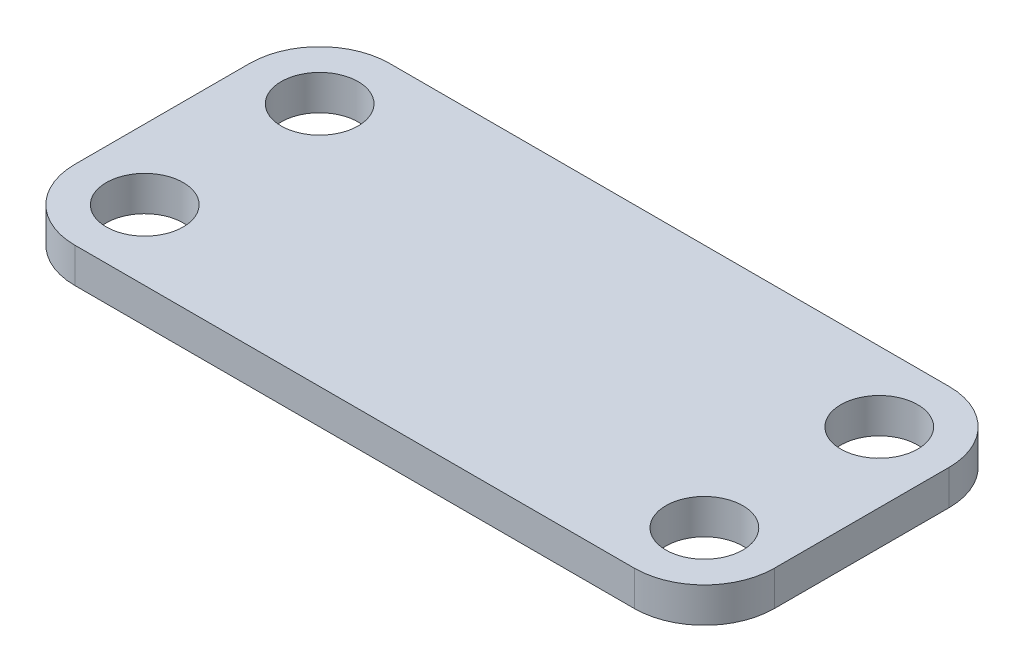
ISO-10303-21;
HEADER;
FILE_DESCRIPTION(('STEP AP214'),'2;1');
FILE_NAME('part.step','',(''),(''),'','','');
FILE_SCHEMA(('AUTOMOTIVE_DESIGN { 1 0 10303 214 1 1 1 1 }'));
ENDSEC;
DATA;
#1=APPLICATION_CONTEXT('core data for automotive mechanical design processes');
#2=APPLICATION_PROTOCOL_DEFINITION('international standard','automotive_design',2000,#1);
#3=PRODUCT_CONTEXT('',#1,'mechanical');
#4=PRODUCT('Part','Part','',(#3));
#5=PRODUCT_RELATED_PRODUCT_CATEGORY('part','',(#4));
#6=PRODUCT_DEFINITION_FORMATION('','',#4);
#7=PRODUCT_DEFINITION_CONTEXT('part definition',#1,'design');
#8=PRODUCT_DEFINITION('design','',#6,#7);
#9=PRODUCT_DEFINITION_SHAPE('','',#8);
#10=(LENGTH_UNIT() NAMED_UNIT(*) SI_UNIT(.MILLI.,.METRE.));
#11=(NAMED_UNIT(*) PLANE_ANGLE_UNIT() SI_UNIT($,.RADIAN.));
#12=(NAMED_UNIT(*) SI_UNIT($,.STERADIAN.) SOLID_ANGLE_UNIT());
#13=UNCERTAINTY_MEASURE_WITH_UNIT(LENGTH_MEASURE(1.E-05),#10,'distance_accuracy_value','');
#14=(GEOMETRIC_REPRESENTATION_CONTEXT(3) GLOBAL_UNCERTAINTY_ASSIGNED_CONTEXT((#13)) GLOBAL_UNIT_ASSIGNED_CONTEXT((#10,
#11,#12)) REPRESENTATION_CONTEXT('',''));
#15=CARTESIAN_POINT('',(0.,0.,0.));
#16=DIRECTION('',(0.,0.,1.));
#17=DIRECTION('',(1.,0.,0.));
#18=AXIS2_PLACEMENT_3D('',#15,#16,#17);
#19=CARTESIAN_POINT('',(10.,1.,-4.5));
#20=DIRECTION('',(-1.,0.,0.));
#21=DIRECTION('',(0.,0.,1.));
#22=AXIS2_PLACEMENT_3D('',#19,#20,#21);
#23=PLANE('',#22);
#24=DIRECTION('',(0.,0.,-1.));
#25=VECTOR('',#24,1.);
#26=CARTESIAN_POINT('',(10.,1.,-4.5));
#27=LINE('',#26,#25);
#28=CARTESIAN_POINT('',(10.,1.,2.5));
#29=VERTEX_POINT('',#28);
#30=CARTESIAN_POINT('',(10.,1.,-2.5));
#31=VERTEX_POINT('',#30);
#32=EDGE_CURVE('E125',#29,#31,#27,.T.);
#33=ORIENTED_EDGE('',*,*,#32,.F.);
#34=DIRECTION('',(0.,-1.,0.));
#35=VECTOR('',#34,1.);
#36=CARTESIAN_POINT('',(10.,1.,2.5));
#37=LINE('',#36,#35);
#38=CARTESIAN_POINT('',(10.,0.,2.5));
#39=VERTEX_POINT('',#38);
#40=EDGE_CURVE('E110',#29,#39,#37,.T.);
#41=ORIENTED_EDGE('',*,*,#40,.T.);
#42=DIRECTION('',(0.,0.,-1.));
#43=VECTOR('',#42,1.);
#44=CARTESIAN_POINT('',(10.,0.,-4.5));
#45=LINE('',#44,#43);
#46=CARTESIAN_POINT('',(10.,0.,-2.5));
#47=VERTEX_POINT('',#46);
#48=EDGE_CURVE('E122',#39,#47,#45,.T.);
#49=ORIENTED_EDGE('',*,*,#48,.T.);
#50=DIRECTION('',(0.,-1.,0.));
#51=VECTOR('',#50,1.);
#52=CARTESIAN_POINT('',(10.,1.,-2.5));
#53=LINE('',#52,#51);
#54=EDGE_CURVE('E127',#47,#31,#53,.F.);
#55=ORIENTED_EDGE('',*,*,#54,.T.);
#56=EDGE_LOOP('',(#33,#41,#49,#55));
#57=FACE_BOUND('',#56,.T.);
#58=ADVANCED_FACE('F41',(#57),#23,.F.);
#59=CARTESIAN_POINT('',(-10.,1.,-4.5));
#60=DIRECTION('',(0.,0.,1.));
#61=DIRECTION('',(1.,0.,0.));
#62=AXIS2_PLACEMENT_3D('',#59,#60,#61);
#63=PLANE('',#62);
#64=DIRECTION('',(-1.,0.,0.));
#65=VECTOR('',#64,1.);
#66=CARTESIAN_POINT('',(-10.,1.,-4.5));
#67=LINE('',#66,#65);
#68=CARTESIAN_POINT('',(8.,1.,-4.5));
#69=VERTEX_POINT('',#68);
#70=CARTESIAN_POINT('',(-8.00000000000001,1.,-4.5));
#71=VERTEX_POINT('',#70);
#72=EDGE_CURVE('E189',#69,#71,#67,.T.);
#73=ORIENTED_EDGE('',*,*,#72,.F.);
#74=DIRECTION('',(0.,-1.,0.));
#75=VECTOR('',#74,1.);
#76=CARTESIAN_POINT('',(8.,1.,-4.5));
#77=LINE('',#76,#75);
#78=CARTESIAN_POINT('',(8.,0.,-4.5));
#79=VERTEX_POINT('',#78);
#80=EDGE_CURVE('E173',#69,#79,#77,.T.);
#81=ORIENTED_EDGE('',*,*,#80,.T.);
#82=DIRECTION('',(-1.,0.,0.));
#83=VECTOR('',#82,1.);
#84=CARTESIAN_POINT('',(-10.,0.,-4.5));
#85=LINE('',#84,#83);
#86=CARTESIAN_POINT('',(-8.00000000000001,0.,-4.5));
#87=VERTEX_POINT('',#86);
#88=EDGE_CURVE('E131',#79,#87,#85,.T.);
#89=ORIENTED_EDGE('',*,*,#88,.T.);
#90=DIRECTION('',(0.,-1.,0.));
#91=VECTOR('',#90,1.);
#92=CARTESIAN_POINT('',(-8.00000000000001,1.,-4.5));
#93=LINE('',#92,#91);
#94=EDGE_CURVE('E171',#87,#71,#93,.F.);
#95=ORIENTED_EDGE('',*,*,#94,.T.);
#96=EDGE_LOOP('',(#73,#81,#89,#95));
#97=FACE_BOUND('',#96,.T.);
#98=ADVANCED_FACE('F233',(#97),#63,.F.);
#99=CARTESIAN_POINT('',(-10.,1.,-4.5));
#100=DIRECTION('',(1.,0.,0.));
#101=DIRECTION('',(0.,0.,-1.));
#102=AXIS2_PLACEMENT_3D('',#99,#100,#101);
#103=PLANE('',#102);
#104=DIRECTION('',(0.,0.,1.));
#105=VECTOR('',#104,1.);
#106=CARTESIAN_POINT('',(-10.,0.,-4.5));
#107=LINE('',#106,#105);
#108=CARTESIAN_POINT('',(-10.,0.,-2.5));
#109=VERTEX_POINT('',#108);
#110=CARTESIAN_POINT('',(-10.,0.,2.5));
#111=VERTEX_POINT('',#110);
#112=EDGE_CURVE('E135',#109,#111,#107,.T.);
#113=ORIENTED_EDGE('',*,*,#112,.T.);
#114=DIRECTION('',(0.,-1.,0.));
#115=VECTOR('',#114,1.);
#116=CARTESIAN_POINT('',(-10.,1.,2.5));
#117=LINE('',#116,#115);
#118=CARTESIAN_POINT('',(-10.,1.,2.5));
#119=VERTEX_POINT('',#118);
#120=EDGE_CURVE('E11',#111,#119,#117,.F.);
#121=ORIENTED_EDGE('',*,*,#120,.T.);
#122=DIRECTION('',(0.,0.,1.));
#123=VECTOR('',#122,1.);
#124=CARTESIAN_POINT('',(-10.,1.,-4.5));
#125=LINE('',#124,#123);
#126=CARTESIAN_POINT('',(-10.,1.,-2.5));
#127=VERTEX_POINT('',#126);
#128=EDGE_CURVE('E179',#127,#119,#125,.T.);
#129=ORIENTED_EDGE('',*,*,#128,.F.);
#130=DIRECTION('',(0.,-1.,0.));
#131=VECTOR('',#130,1.);
#132=CARTESIAN_POINT('',(-10.,1.,-2.5));
#133=LINE('',#132,#131);
#134=EDGE_CURVE('E49',#127,#109,#133,.T.);
#135=ORIENTED_EDGE('',*,*,#134,.T.);
#136=EDGE_LOOP('',(#113,#121,#129,#135));
#137=FACE_BOUND('',#136,.T.);
#138=ADVANCED_FACE('F178',(#137),#103,.F.);
#139=CARTESIAN_POINT('',(-10.,1.,4.5));
#140=DIRECTION('',(0.,0.,-1.));
#141=DIRECTION('',(-1.,0.,0.));
#142=AXIS2_PLACEMENT_3D('',#139,#140,#141);
#143=PLANE('',#142);
#144=DIRECTION('',(1.,0.,0.));
#145=VECTOR('',#144,1.);
#146=CARTESIAN_POINT('',(-10.,0.,4.5));
#147=LINE('',#146,#145);
#148=CARTESIAN_POINT('',(-8.,0.,4.5));
#149=VERTEX_POINT('',#148);
#150=CARTESIAN_POINT('',(8.,0.,4.5));
#151=VERTEX_POINT('',#150);
#152=EDGE_CURVE('E145',#149,#151,#147,.T.);
#153=ORIENTED_EDGE('',*,*,#152,.T.);
#154=DIRECTION('',(0.,-1.,0.));
#155=VECTOR('',#154,1.);
#156=CARTESIAN_POINT('',(8.,1.,4.5));
#157=LINE('',#156,#155);
#158=CARTESIAN_POINT('',(8.,1.,4.5));
#159=VERTEX_POINT('',#158);
#160=EDGE_CURVE('E111',#151,#159,#157,.F.);
#161=ORIENTED_EDGE('',*,*,#160,.T.);
#162=DIRECTION('',(1.,0.,0.));
#163=VECTOR('',#162,1.);
#164=CARTESIAN_POINT('',(-10.,1.,4.5));
#165=LINE('',#164,#163);
#166=CARTESIAN_POINT('',(-8.,1.,4.5));
#167=VERTEX_POINT('',#166);
#168=EDGE_CURVE('E141',#167,#159,#165,.T.);
#169=ORIENTED_EDGE('',*,*,#168,.F.);
#170=DIRECTION('',(0.,-1.,0.));
#171=VECTOR('',#170,1.);
#172=CARTESIAN_POINT('',(-8.,1.,4.5));
#173=LINE('',#172,#171);
#174=EDGE_CURVE('E116',#167,#149,#173,.T.);
#175=ORIENTED_EDGE('',*,*,#174,.T.);
#176=EDGE_LOOP('',(#153,#161,#169,#175));
#177=FACE_BOUND('',#176,.T.);
#178=ADVANCED_FACE('F187',(#177),#143,.F.);
#179=CARTESIAN_POINT('',(0.,1.,0.));
#180=DIRECTION('',(0.,1.,0.));
#181=DIRECTION('',(0.,0.,1.));
#182=AXIS2_PLACEMENT_3D('',#179,#180,#181);
#183=PLANE('',#182);
#184=CARTESIAN_POINT('',(-8.,1.,-2.5));
#185=DIRECTION('',(0.,1.,0.));
#186=DIRECTION('',(0.,0.,1.));
#187=AXIS2_PLACEMENT_3D('',#184,#185,#186);
#188=CIRCLE('',#187,1.1);
#189=CARTESIAN_POINT('',(-8.,1.,-1.4));
#190=VERTEX_POINT('',#189);
#191=EDGE_CURVE('E155',#190,#190,#188,.T.);
#192=ORIENTED_EDGE('',*,*,#191,.F.);
#193=EDGE_LOOP('',(#192));
#194=FACE_BOUND('',#193,.T.);
#195=CARTESIAN_POINT('',(8.,1.,-2.5));
#196=DIRECTION('',(0.,1.,0.));
#197=DIRECTION('',(0.,0.,1.));
#198=AXIS2_PLACEMENT_3D('',#195,#196,#197);
#199=CIRCLE('',#198,1.1);
#200=CARTESIAN_POINT('',(8.,1.,-1.4));
#201=VERTEX_POINT('',#200);
#202=EDGE_CURVE('E154',#201,#201,#199,.T.);
#203=ORIENTED_EDGE('',*,*,#202,.F.);
#204=EDGE_LOOP('',(#203));
#205=FACE_BOUND('',#204,.T.);
#206=CARTESIAN_POINT('',(8.,1.,2.5));
#207=DIRECTION('',(0.,1.,0.));
#208=DIRECTION('',(0.,0.,1.));
#209=AXIS2_PLACEMENT_3D('',#206,#207,#208);
#210=CIRCLE('',#209,1.1);
#211=CARTESIAN_POINT('',(8.,1.,3.6));
#212=VERTEX_POINT('',#211);
#213=EDGE_CURVE('E150',#212,#212,#210,.T.);
#214=ORIENTED_EDGE('',*,*,#213,.F.);
#215=EDGE_LOOP('',(#214));
#216=FACE_BOUND('',#215,.T.);
#217=CARTESIAN_POINT('',(-8.,1.,2.5));
#218=DIRECTION('',(0.,1.,0.));
#219=DIRECTION('',(0.,0.,1.));
#220=AXIS2_PLACEMENT_3D('',#217,#218,#219);
#221=CIRCLE('',#220,1.1);
#222=CARTESIAN_POINT('',(-8.,1.,3.6));
#223=VERTEX_POINT('',#222);
#224=EDGE_CURVE('E138',#223,#223,#221,.T.);
#225=ORIENTED_EDGE('',*,*,#224,.F.);
#226=EDGE_LOOP('',(#225));
#227=FACE_BOUND('',#226,.T.);
#228=ORIENTED_EDGE('',*,*,#168,.T.);
#229=CARTESIAN_POINT('',(8.,1.,2.5));
#230=DIRECTION('',(0.,1.,0.));
#231=DIRECTION('',(0.,0.,1.));
#232=AXIS2_PLACEMENT_3D('',#229,#230,#231);
#233=CIRCLE('',#232,2.);
#234=EDGE_CURVE('E169',#159,#29,#233,.T.);
#235=ORIENTED_EDGE('',*,*,#234,.T.);
#236=ORIENTED_EDGE('',*,*,#32,.T.);
#237=CARTESIAN_POINT('',(8.,1.,-2.5));
#238=DIRECTION('',(0.,1.,0.));
#239=DIRECTION('',(0.,0.,1.));
#240=AXIS2_PLACEMENT_3D('',#237,#238,#239);
#241=CIRCLE('',#240,2.);
#242=EDGE_CURVE('E167',#31,#69,#241,.T.);
#243=ORIENTED_EDGE('',*,*,#242,.T.);
#244=ORIENTED_EDGE('',*,*,#72,.T.);
#245=CARTESIAN_POINT('',(-8.00000000000001,1.,-2.5));
#246=DIRECTION('',(0.,1.,0.));
#247=DIRECTION('',(0.,0.,1.));
#248=AXIS2_PLACEMENT_3D('',#245,#246,#247);
#249=CIRCLE('',#248,2.);
#250=EDGE_CURVE('E61',#71,#127,#249,.T.);
#251=ORIENTED_EDGE('',*,*,#250,.T.);
#252=ORIENTED_EDGE('',*,*,#128,.T.);
#253=CARTESIAN_POINT('',(-8.,1.,2.5));
#254=DIRECTION('',(0.,1.,0.));
#255=DIRECTION('',(0.,0.,1.));
#256=AXIS2_PLACEMENT_3D('',#253,#254,#255);
#257=CIRCLE('',#256,2.);
#258=EDGE_CURVE('E165',#119,#167,#257,.T.);
#259=ORIENTED_EDGE('',*,*,#258,.T.);
#260=EDGE_LOOP('',(#228,#235,#236,#243,#244,#251,#252,#259));
#261=FACE_BOUND('',#260,.T.);
#262=ADVANCED_FACE('F208',(#194,#205,#216,#227,#261),#183,.T.);
#263=CARTESIAN_POINT('',(0.,0.,0.));
#264=DIRECTION('',(0.,1.,0.));
#265=DIRECTION('',(0.,0.,1.));
#266=AXIS2_PLACEMENT_3D('',#263,#264,#265);
#267=PLANE('',#266);
#268=CARTESIAN_POINT('',(-8.,0.,-2.5));
#269=DIRECTION('',(0.,1.,0.));
#270=DIRECTION('',(0.,0.,1.));
#271=AXIS2_PLACEMENT_3D('',#268,#269,#270);
#272=CIRCLE('',#271,1.1);
#273=CARTESIAN_POINT('',(-8.,0.,-1.4));
#274=VERTEX_POINT('',#273);
#275=EDGE_CURVE('E151',#274,#274,#272,.T.);
#276=ORIENTED_EDGE('',*,*,#275,.T.);
#277=EDGE_LOOP('',(#276));
#278=FACE_BOUND('',#277,.T.);
#279=CARTESIAN_POINT('',(8.,0.,-2.5));
#280=DIRECTION('',(0.,1.,0.));
#281=DIRECTION('',(0.,0.,1.));
#282=AXIS2_PLACEMENT_3D('',#279,#280,#281);
#283=CIRCLE('',#282,1.1);
#284=CARTESIAN_POINT('',(8.,0.,-1.4));
#285=VERTEX_POINT('',#284);
#286=EDGE_CURVE('E197',#285,#285,#283,.T.);
#287=ORIENTED_EDGE('',*,*,#286,.T.);
#288=EDGE_LOOP('',(#287));
#289=FACE_BOUND('',#288,.T.);
#290=CARTESIAN_POINT('',(8.,0.,2.5));
#291=DIRECTION('',(0.,1.,0.));
#292=DIRECTION('',(0.,0.,1.));
#293=AXIS2_PLACEMENT_3D('',#290,#291,#292);
#294=CIRCLE('',#293,1.1);
#295=CARTESIAN_POINT('',(8.,0.,3.6));
#296=VERTEX_POINT('',#295);
#297=EDGE_CURVE('E147',#296,#296,#294,.T.);
#298=ORIENTED_EDGE('',*,*,#297,.T.);
#299=EDGE_LOOP('',(#298));
#300=FACE_BOUND('',#299,.T.);
#301=CARTESIAN_POINT('',(-8.,0.,2.5));
#302=DIRECTION('',(0.,1.,0.));
#303=DIRECTION('',(0.,0.,1.));
#304=AXIS2_PLACEMENT_3D('',#301,#302,#303);
#305=CIRCLE('',#304,1.1);
#306=CARTESIAN_POINT('',(-8.,0.,3.6));
#307=VERTEX_POINT('',#306);
#308=EDGE_CURVE('E132',#307,#307,#305,.T.);
#309=ORIENTED_EDGE('',*,*,#308,.T.);
#310=EDGE_LOOP('',(#309));
#311=FACE_BOUND('',#310,.T.);
#312=ORIENTED_EDGE('',*,*,#48,.F.);
#313=CARTESIAN_POINT('',(8.,0.,2.5));
#314=DIRECTION('',(0.,1.,0.));
#315=DIRECTION('',(0.,0.,1.));
#316=AXIS2_PLACEMENT_3D('',#313,#314,#315);
#317=CIRCLE('',#316,2.);
#318=EDGE_CURVE('E106',#39,#151,#317,.F.);
#319=ORIENTED_EDGE('',*,*,#318,.T.);
#320=ORIENTED_EDGE('',*,*,#152,.F.);
#321=CARTESIAN_POINT('',(-8.,0.,2.5));
#322=DIRECTION('',(0.,1.,0.));
#323=DIRECTION('',(0.,0.,1.));
#324=AXIS2_PLACEMENT_3D('',#321,#322,#323);
#325=CIRCLE('',#324,2.);
#326=EDGE_CURVE('E158',#149,#111,#325,.F.);
#327=ORIENTED_EDGE('',*,*,#326,.T.);
#328=ORIENTED_EDGE('',*,*,#112,.F.);
#329=CARTESIAN_POINT('',(-8.00000000000001,0.,-2.5));
#330=DIRECTION('',(0.,1.,0.));
#331=DIRECTION('',(0.,0.,1.));
#332=AXIS2_PLACEMENT_3D('',#329,#330,#331);
#333=CIRCLE('',#332,2.);
#334=EDGE_CURVE('E126',#109,#87,#333,.F.);
#335=ORIENTED_EDGE('',*,*,#334,.T.);
#336=ORIENTED_EDGE('',*,*,#88,.F.);
#337=CARTESIAN_POINT('',(8.,0.,-2.5));
#338=DIRECTION('',(0.,1.,0.));
#339=DIRECTION('',(0.,0.,1.));
#340=AXIS2_PLACEMENT_3D('',#337,#338,#339);
#341=CIRCLE('',#340,2.);
#342=EDGE_CURVE('E117',#79,#47,#341,.F.);
#343=ORIENTED_EDGE('',*,*,#342,.T.);
#344=EDGE_LOOP('',(#312,#319,#320,#327,#328,#335,#336,#343));
#345=FACE_BOUND('',#344,.T.);
#346=ADVANCED_FACE('F129',(#278,#289,#300,#311,#345),#267,.F.);
#347=CARTESIAN_POINT('',(-8.,1.,2.5));
#348=DIRECTION('',(0.,1.,0.));
#349=DIRECTION('',(0.,0.,1.));
#350=AXIS2_PLACEMENT_3D('',#347,#348,#349);
#351=CYLINDRICAL_SURFACE('',#350,1.1);
#352=ORIENTED_EDGE('',*,*,#224,.T.);
#353=EDGE_LOOP('',(#352));
#354=FACE_BOUND('',#353,.T.);
#355=ORIENTED_EDGE('',*,*,#308,.F.);
#356=EDGE_LOOP('',(#355));
#357=FACE_BOUND('',#356,.T.);
#358=ADVANCED_FACE('F218',(#354,#357),#351,.F.);
#359=CARTESIAN_POINT('',(8.,1.,2.5));
#360=DIRECTION('',(0.,1.,0.));
#361=DIRECTION('',(0.,0.,1.));
#362=AXIS2_PLACEMENT_3D('',#359,#360,#361);
#363=CYLINDRICAL_SURFACE('',#362,1.1);
#364=ORIENTED_EDGE('',*,*,#213,.T.);
#365=EDGE_LOOP('',(#364));
#366=FACE_BOUND('',#365,.T.);
#367=ORIENTED_EDGE('',*,*,#297,.F.);
#368=EDGE_LOOP('',(#367));
#369=FACE_BOUND('',#368,.T.);
#370=ADVANCED_FACE('F221',(#366,#369),#363,.F.);
#371=CARTESIAN_POINT('',(8.,1.,-2.5));
#372=DIRECTION('',(0.,1.,0.));
#373=DIRECTION('',(0.,0.,1.));
#374=AXIS2_PLACEMENT_3D('',#371,#372,#373);
#375=CYLINDRICAL_SURFACE('',#374,1.1);
#376=ORIENTED_EDGE('',*,*,#202,.T.);
#377=EDGE_LOOP('',(#376));
#378=FACE_BOUND('',#377,.T.);
#379=ORIENTED_EDGE('',*,*,#286,.F.);
#380=EDGE_LOOP('',(#379));
#381=FACE_BOUND('',#380,.T.);
#382=ADVANCED_FACE('F327',(#378,#381),#375,.F.);
#383=CARTESIAN_POINT('',(-8.,1.,-2.5));
#384=DIRECTION('',(0.,1.,0.));
#385=DIRECTION('',(0.,0.,1.));
#386=AXIS2_PLACEMENT_3D('',#383,#384,#385);
#387=CYLINDRICAL_SURFACE('',#386,1.1);
#388=ORIENTED_EDGE('',*,*,#191,.T.);
#389=EDGE_LOOP('',(#388));
#390=FACE_BOUND('',#389,.T.);
#391=ORIENTED_EDGE('',*,*,#275,.F.);
#392=EDGE_LOOP('',(#391));
#393=FACE_BOUND('',#392,.T.);
#394=ADVANCED_FACE('F205',(#390,#393),#387,.F.);
#395=CARTESIAN_POINT('',(8.,1.,2.5));
#396=DIRECTION('',(0.,-1.,0.));
#397=DIRECTION('',(0.,0.,-1.));
#398=AXIS2_PLACEMENT_3D('',#395,#396,#397);
#399=CYLINDRICAL_SURFACE('',#398,2.);
#400=ORIENTED_EDGE('',*,*,#234,.F.);
#401=ORIENTED_EDGE('',*,*,#160,.F.);
#402=ORIENTED_EDGE('',*,*,#318,.F.);
#403=ORIENTED_EDGE('',*,*,#40,.F.);
#404=EDGE_LOOP('',(#400,#401,#402,#403));
#405=FACE_BOUND('',#404,.T.);
#406=ADVANCED_FACE('F109',(#405),#399,.T.);
#407=CARTESIAN_POINT('',(8.,1.,-2.5));
#408=DIRECTION('',(0.,-1.,0.));
#409=DIRECTION('',(0.,0.,-1.));
#410=AXIS2_PLACEMENT_3D('',#407,#408,#409);
#411=CYLINDRICAL_SURFACE('',#410,2.);
#412=ORIENTED_EDGE('',*,*,#242,.F.);
#413=ORIENTED_EDGE('',*,*,#54,.F.);
#414=ORIENTED_EDGE('',*,*,#342,.F.);
#415=ORIENTED_EDGE('',*,*,#80,.F.);
#416=EDGE_LOOP('',(#412,#413,#414,#415));
#417=FACE_BOUND('',#416,.T.);
#418=ADVANCED_FACE('F244',(#417),#411,.T.);
#419=CARTESIAN_POINT('',(-8.,1.,2.5));
#420=DIRECTION('',(0.,-1.,0.));
#421=DIRECTION('',(0.,0.,-1.));
#422=AXIS2_PLACEMENT_3D('',#419,#420,#421);
#423=CYLINDRICAL_SURFACE('',#422,2.);
#424=ORIENTED_EDGE('',*,*,#258,.F.);
#425=ORIENTED_EDGE('',*,*,#120,.F.);
#426=ORIENTED_EDGE('',*,*,#326,.F.);
#427=ORIENTED_EDGE('',*,*,#174,.F.);
#428=EDGE_LOOP('',(#424,#425,#426,#427));
#429=FACE_BOUND('',#428,.T.);
#430=ADVANCED_FACE('F184',(#429),#423,.T.);
#431=CARTESIAN_POINT('',(-8.00000000000001,1.,-2.5));
#432=DIRECTION('',(0.,-1.,0.));
#433=DIRECTION('',(0.,0.,-1.));
#434=AXIS2_PLACEMENT_3D('',#431,#432,#433);
#435=CYLINDRICAL_SURFACE('',#434,2.);
#436=ORIENTED_EDGE('',*,*,#250,.F.);
#437=ORIENTED_EDGE('',*,*,#94,.F.);
#438=ORIENTED_EDGE('',*,*,#334,.F.);
#439=ORIENTED_EDGE('',*,*,#134,.F.);
#440=EDGE_LOOP('',(#436,#437,#438,#439));
#441=FACE_BOUND('',#440,.T.);
#442=ADVANCED_FACE('F43',(#441),#435,.T.);
#443=CLOSED_SHELL('',(#58,#98,#138,#178,#262,#346,#358,#370,#382,#394,#406,#418,#430,#442));
#444=MANIFOLD_SOLID_BREP('B2',#443);
#445=ADVANCED_BREP_SHAPE_REPRESENTATION('',(#18,#444),#14);
#446=SHAPE_DEFINITION_REPRESENTATION(#9,#445);
ENDSEC;
END-ISO-10303-21;
